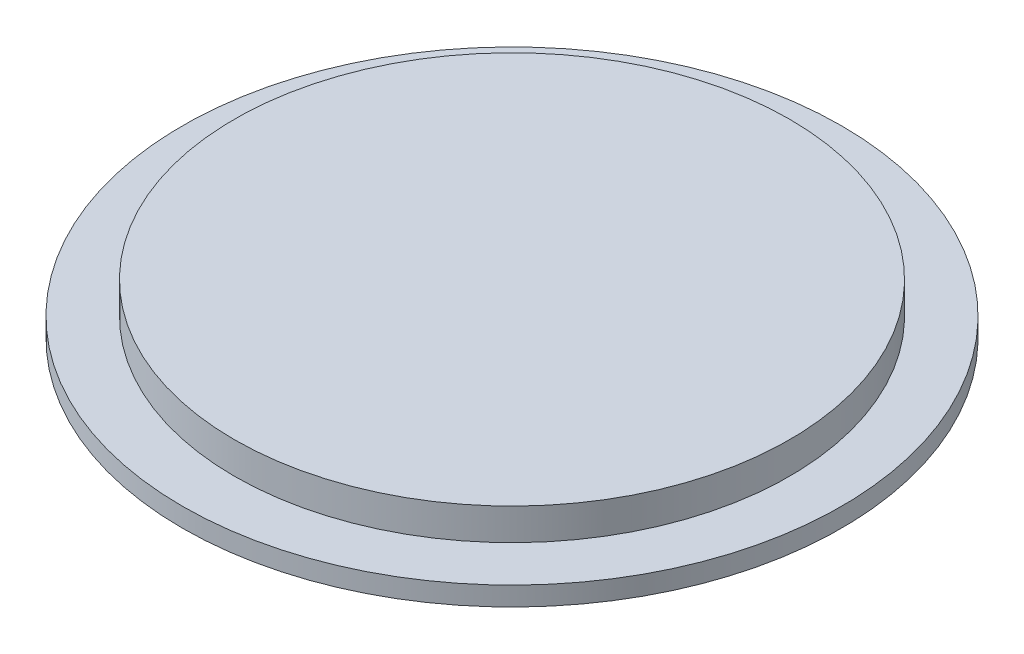
ISO-10303-21;
HEADER;
FILE_DESCRIPTION(('STEP AP214'),'2;1');
FILE_NAME('part.step','',(''),(''),'','','');
FILE_SCHEMA(('AUTOMOTIVE_DESIGN { 1 0 10303 214 1 1 1 1 }'));
ENDSEC;
DATA;
#1=APPLICATION_CONTEXT('core data for automotive mechanical design processes');
#2=APPLICATION_PROTOCOL_DEFINITION('international standard','automotive_design',2000,#1);
#3=PRODUCT_CONTEXT('',#1,'mechanical');
#4=PRODUCT('Part','Part','',(#3));
#5=PRODUCT_RELATED_PRODUCT_CATEGORY('part','',(#4));
#6=PRODUCT_DEFINITION_FORMATION('','',#4);
#7=PRODUCT_DEFINITION_CONTEXT('part definition',#1,'design');
#8=PRODUCT_DEFINITION('design','',#6,#7);
#9=PRODUCT_DEFINITION_SHAPE('','',#8);
#10=(LENGTH_UNIT() NAMED_UNIT(*) SI_UNIT(.MILLI.,.METRE.));
#11=(NAMED_UNIT(*) PLANE_ANGLE_UNIT() SI_UNIT($,.RADIAN.));
#12=(NAMED_UNIT(*) SI_UNIT($,.STERADIAN.) SOLID_ANGLE_UNIT());
#13=UNCERTAINTY_MEASURE_WITH_UNIT(LENGTH_MEASURE(1.E-05),#10,'distance_accuracy_value','');
#14=(GEOMETRIC_REPRESENTATION_CONTEXT(3) GLOBAL_UNCERTAINTY_ASSIGNED_CONTEXT((#13)) GLOBAL_UNIT_ASSIGNED_CONTEXT((#10,
#11,#12)) REPRESENTATION_CONTEXT('',''));
#15=CARTESIAN_POINT('',(0.,0.,0.));
#16=DIRECTION('',(0.,0.,1.));
#17=DIRECTION('',(1.,0.,0.));
#18=AXIS2_PLACEMENT_3D('',#15,#16,#17);
#19=CARTESIAN_POINT('',(0.,3.,0.));
#20=DIRECTION('',(0.,-1.,0.));
#21=DIRECTION('',(0.,0.,-1.));
#22=AXIS2_PLACEMENT_3D('',#19,#20,#21);
#23=CYLINDRICAL_SURFACE('',#22,52.);
#24=CARTESIAN_POINT('',(0.,3.,0.));
#25=DIRECTION('',(0.,1.,0.));
#26=DIRECTION('',(0.,0.,1.));
#27=AXIS2_PLACEMENT_3D('',#24,#25,#26);
#28=CIRCLE('',#27,52.);
#29=CARTESIAN_POINT('',(0.,3.,52.));
#30=VERTEX_POINT('',#29);
#31=EDGE_CURVE('E41',#30,#30,#28,.T.);
#32=ORIENTED_EDGE('',*,*,#31,.F.);
#33=EDGE_LOOP('',(#32));
#34=FACE_BOUND('',#33,.T.);
#35=CARTESIAN_POINT('',(0.,0.,0.));
#36=DIRECTION('',(0.,1.,0.));
#37=DIRECTION('',(0.,0.,1.));
#38=AXIS2_PLACEMENT_3D('',#35,#36,#37);
#39=CIRCLE('',#38,52.);
#40=CARTESIAN_POINT('',(0.,0.,52.));
#41=VERTEX_POINT('',#40);
#42=EDGE_CURVE('E37',#41,#41,#39,.T.);
#43=ORIENTED_EDGE('',*,*,#42,.T.);
#44=EDGE_LOOP('',(#43));
#45=FACE_BOUND('',#44,.T.);
#46=ADVANCED_FACE('F34',(#34,#45),#23,.T.);
#47=CARTESIAN_POINT('',(0.,3.,0.));
#48=DIRECTION('',(0.,1.,0.));
#49=DIRECTION('',(0.,0.,1.));
#50=AXIS2_PLACEMENT_3D('',#47,#48,#49);
#51=PLANE('',#50);
#52=CARTESIAN_POINT('',(0.,3.,0.));
#53=DIRECTION('',(0.,1.,0.));
#54=DIRECTION('',(0.,0.,1.));
#55=AXIS2_PLACEMENT_3D('',#52,#53,#54);
#56=CIRCLE('',#55,43.8);
#57=CARTESIAN_POINT('',(0.,3.,43.8));
#58=VERTEX_POINT('',#57);
#59=EDGE_CURVE('E10',#58,#58,#56,.T.);
#60=ORIENTED_EDGE('',*,*,#59,.F.);
#61=EDGE_LOOP('',(#60));
#62=FACE_BOUND('',#61,.T.);
#63=ORIENTED_EDGE('',*,*,#31,.T.);
#64=EDGE_LOOP('',(#63));
#65=FACE_BOUND('',#64,.T.);
#66=ADVANCED_FACE('F58',(#62,#65),#51,.T.);
#67=CARTESIAN_POINT('',(0.,0.,0.));
#68=DIRECTION('',(0.,1.,0.));
#69=DIRECTION('',(0.,0.,1.));
#70=AXIS2_PLACEMENT_3D('',#67,#68,#69);
#71=PLANE('',#70);
#72=ORIENTED_EDGE('',*,*,#42,.F.);
#73=EDGE_LOOP('',(#72));
#74=FACE_BOUND('',#73,.T.);
#75=ADVANCED_FACE('F55',(#74),#71,.F.);
#76=CARTESIAN_POINT('',(0.,8.,0.));
#77=DIRECTION('',(0.,-1.,0.));
#78=DIRECTION('',(0.,0.,-1.));
#79=AXIS2_PLACEMENT_3D('',#76,#77,#78);
#80=CYLINDRICAL_SURFACE('',#79,43.8);
#81=CARTESIAN_POINT('',(0.,8.,0.));
#82=DIRECTION('',(0.,1.,0.));
#83=DIRECTION('',(0.,0.,1.));
#84=AXIS2_PLACEMENT_3D('',#81,#82,#83);
#85=CIRCLE('',#84,43.8);
#86=CARTESIAN_POINT('',(0.,8.,43.8));
#87=VERTEX_POINT('',#86);
#88=EDGE_CURVE('E47',#87,#87,#85,.T.);
#89=ORIENTED_EDGE('',*,*,#88,.F.);
#90=EDGE_LOOP('',(#89));
#91=FACE_BOUND('',#90,.T.);
#92=ORIENTED_EDGE('',*,*,#59,.T.);
#93=EDGE_LOOP('',(#92));
#94=FACE_BOUND('',#93,.T.);
#95=ADVANCED_FACE('F57',(#91,#94),#80,.T.);
#96=CARTESIAN_POINT('',(0.,8.,0.));
#97=DIRECTION('',(0.,1.,0.));
#98=DIRECTION('',(0.,0.,1.));
#99=AXIS2_PLACEMENT_3D('',#96,#97,#98);
#100=PLANE('',#99);
#101=ORIENTED_EDGE('',*,*,#88,.T.);
#102=EDGE_LOOP('',(#101));
#103=FACE_BOUND('',#102,.T.);
#104=ADVANCED_FACE('F63',(#103),#100,.T.);
#105=CLOSED_SHELL('',(#46,#66,#75,#95,#104));
#106=MANIFOLD_SOLID_BREP('B2',#105);
#107=ADVANCED_BREP_SHAPE_REPRESENTATION('',(#18,#106),#14);
#108=SHAPE_DEFINITION_REPRESENTATION(#9,#107);
ENDSEC;
END-ISO-10303-21;
